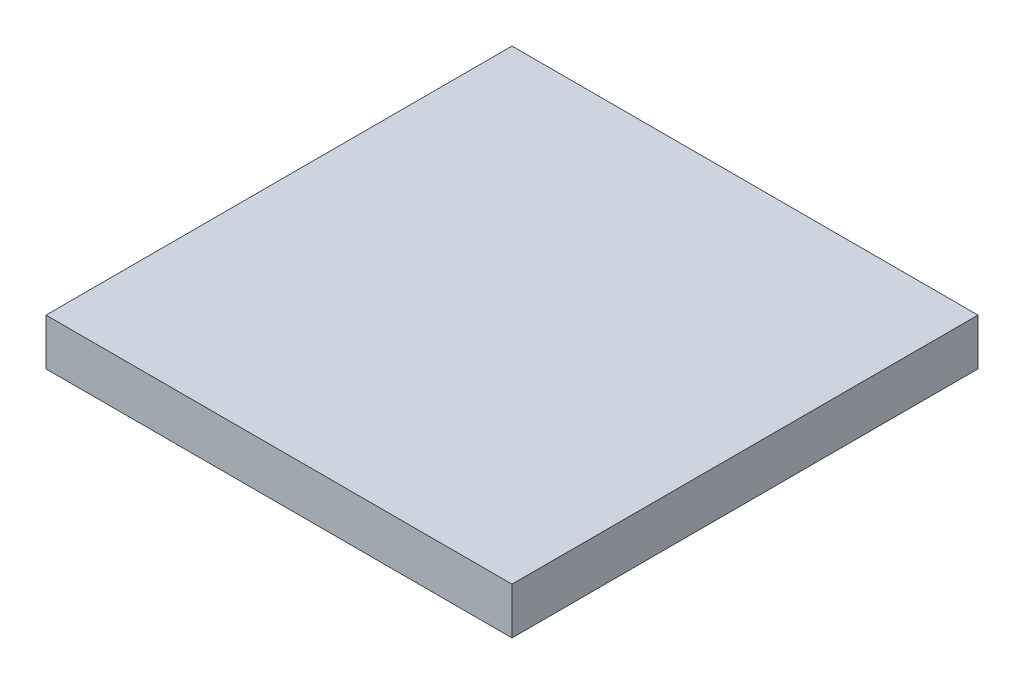
ISO-10303-21;
HEADER;
FILE_DESCRIPTION(('STEP AP214'),'2;1');
FILE_NAME('part.step','',(''),(''),'','','');
FILE_SCHEMA(('AUTOMOTIVE_DESIGN { 1 0 10303 214 1 1 1 1 }'));
ENDSEC;
DATA;
#1=APPLICATION_CONTEXT('core data for automotive mechanical design processes');
#2=APPLICATION_PROTOCOL_DEFINITION('international standard','automotive_design',2000,#1);
#3=PRODUCT_CONTEXT('',#1,'mechanical');
#4=PRODUCT('Part','Part','',(#3));
#5=PRODUCT_RELATED_PRODUCT_CATEGORY('part','',(#4));
#6=PRODUCT_DEFINITION_FORMATION('','',#4);
#7=PRODUCT_DEFINITION_CONTEXT('part definition',#1,'design');
#8=PRODUCT_DEFINITION('design','',#6,#7);
#9=PRODUCT_DEFINITION_SHAPE('','',#8);
#10=(LENGTH_UNIT() NAMED_UNIT(*) SI_UNIT(.MILLI.,.METRE.));
#11=(NAMED_UNIT(*) PLANE_ANGLE_UNIT() SI_UNIT($,.RADIAN.));
#12=(NAMED_UNIT(*) SI_UNIT($,.STERADIAN.) SOLID_ANGLE_UNIT());
#13=UNCERTAINTY_MEASURE_WITH_UNIT(LENGTH_MEASURE(1.E-05),#10,'distance_accuracy_value','');
#14=(GEOMETRIC_REPRESENTATION_CONTEXT(3) GLOBAL_UNCERTAINTY_ASSIGNED_CONTEXT((#13)) GLOBAL_UNIT_ASSIGNED_CONTEXT((#10,
#11,#12)) REPRESENTATION_CONTEXT('',''));
#15=CARTESIAN_POINT('',(0.,0.,0.));
#16=DIRECTION('',(0.,0.,1.));
#17=DIRECTION('',(1.,0.,0.));
#18=AXIS2_PLACEMENT_3D('',#15,#16,#17);
#19=CARTESIAN_POINT('',(50.,10.,50.));
#20=DIRECTION('',(-1.,0.,0.));
#21=DIRECTION('',(0.,0.,1.));
#22=AXIS2_PLACEMENT_3D('',#19,#20,#21);
#23=PLANE('',#22);
#24=DIRECTION('',(0.,0.,-1.));
#25=VECTOR('',#24,1.);
#26=CARTESIAN_POINT('',(50.,0.,50.));
#27=LINE('',#26,#25);
#28=CARTESIAN_POINT('',(50.,0.,50.));
#29=VERTEX_POINT('',#28);
#30=CARTESIAN_POINT('',(50.,0.,-50.));
#31=VERTEX_POINT('',#30);
#32=EDGE_CURVE('E98',#29,#31,#27,.T.);
#33=ORIENTED_EDGE('',*,*,#32,.T.);
#34=DIRECTION('',(0.,-1.,0.));
#35=VECTOR('',#34,1.);
#36=CARTESIAN_POINT('',(50.,10.,-50.));
#37=LINE('',#36,#35);
#38=CARTESIAN_POINT('',(50.,10.,-50.));
#39=VERTEX_POINT('',#38);
#40=EDGE_CURVE('E11',#39,#31,#37,.T.);
#41=ORIENTED_EDGE('',*,*,#40,.F.);
#42=DIRECTION('',(0.,0.,-1.));
#43=VECTOR('',#42,1.);
#44=CARTESIAN_POINT('',(50.,10.,50.));
#45=LINE('',#44,#43);
#46=CARTESIAN_POINT('',(50.,10.,50.));
#47=VERTEX_POINT('',#46);
#48=EDGE_CURVE('E86',#47,#39,#45,.T.);
#49=ORIENTED_EDGE('',*,*,#48,.F.);
#50=DIRECTION('',(0.,-1.,0.));
#51=VECTOR('',#50,1.);
#52=CARTESIAN_POINT('',(50.,10.,50.));
#53=LINE('',#52,#51);
#54=EDGE_CURVE('E94',#47,#29,#53,.T.);
#55=ORIENTED_EDGE('',*,*,#54,.T.);
#56=EDGE_LOOP('',(#33,#41,#49,#55));
#57=FACE_BOUND('',#56,.T.);
#58=ADVANCED_FACE('F35',(#57),#23,.F.);
#59=CARTESIAN_POINT('',(-50.,10.,-50.));
#60=DIRECTION('',(0.,0.,1.));
#61=DIRECTION('',(1.,0.,0.));
#62=AXIS2_PLACEMENT_3D('',#59,#60,#61);
#63=PLANE('',#62);
#64=DIRECTION('',(-1.,0.,0.));
#65=VECTOR('',#64,1.);
#66=CARTESIAN_POINT('',(-50.,0.,-50.));
#67=LINE('',#66,#65);
#68=CARTESIAN_POINT('',(-50.,0.,-50.));
#69=VERTEX_POINT('',#68);
#70=EDGE_CURVE('E90',#31,#69,#67,.T.);
#71=ORIENTED_EDGE('',*,*,#70,.T.);
#72=DIRECTION('',(0.,-1.,0.));
#73=VECTOR('',#72,1.);
#74=CARTESIAN_POINT('',(-50.,10.,-50.));
#75=LINE('',#74,#73);
#76=CARTESIAN_POINT('',(-50.,10.,-50.));
#77=VERTEX_POINT('',#76);
#78=EDGE_CURVE('E43',#77,#69,#75,.T.);
#79=ORIENTED_EDGE('',*,*,#78,.F.);
#80=DIRECTION('',(-1.,0.,0.));
#81=VECTOR('',#80,1.);
#82=CARTESIAN_POINT('',(-50.,10.,-50.));
#83=LINE('',#82,#81);
#84=EDGE_CURVE('E81',#39,#77,#83,.T.);
#85=ORIENTED_EDGE('',*,*,#84,.F.);
#86=ORIENTED_EDGE('',*,*,#40,.T.);
#87=EDGE_LOOP('',(#71,#79,#85,#86));
#88=FACE_BOUND('',#87,.T.);
#89=ADVANCED_FACE('F89',(#88),#63,.F.);
#90=CARTESIAN_POINT('',(-50.,10.,50.));
#91=DIRECTION('',(1.,0.,0.));
#92=DIRECTION('',(0.,0.,-1.));
#93=AXIS2_PLACEMENT_3D('',#90,#91,#92);
#94=PLANE('',#93);
#95=DIRECTION('',(0.,0.,1.));
#96=VECTOR('',#95,1.);
#97=CARTESIAN_POINT('',(-50.,0.,50.));
#98=LINE('',#97,#96);
#99=CARTESIAN_POINT('',(-50.,0.,50.));
#100=VERTEX_POINT('',#99);
#101=EDGE_CURVE('E68',#69,#100,#98,.T.);
#102=ORIENTED_EDGE('',*,*,#101,.T.);
#103=DIRECTION('',(0.,-1.,0.));
#104=VECTOR('',#103,1.);
#105=CARTESIAN_POINT('',(-50.,10.,50.));
#106=LINE('',#105,#104);
#107=CARTESIAN_POINT('',(-50.,10.,50.));
#108=VERTEX_POINT('',#107);
#109=EDGE_CURVE('E91',#108,#100,#106,.T.);
#110=ORIENTED_EDGE('',*,*,#109,.F.);
#111=DIRECTION('',(0.,0.,1.));
#112=VECTOR('',#111,1.);
#113=CARTESIAN_POINT('',(-50.,10.,50.));
#114=LINE('',#113,#112);
#115=EDGE_CURVE('E84',#77,#108,#114,.T.);
#116=ORIENTED_EDGE('',*,*,#115,.F.);
#117=ORIENTED_EDGE('',*,*,#78,.T.);
#118=EDGE_LOOP('',(#102,#110,#116,#117));
#119=FACE_BOUND('',#118,.T.);
#120=ADVANCED_FACE('F92',(#119),#94,.F.);
#121=CARTESIAN_POINT('',(-50.,10.,50.));
#122=DIRECTION('',(0.,0.,-1.));
#123=DIRECTION('',(-1.,0.,0.));
#124=AXIS2_PLACEMENT_3D('',#121,#122,#123);
#125=PLANE('',#124);
#126=DIRECTION('',(1.,0.,0.));
#127=VECTOR('',#126,1.);
#128=CARTESIAN_POINT('',(-50.,0.,50.));
#129=LINE('',#128,#127);
#130=EDGE_CURVE('E74',#100,#29,#129,.T.);
#131=ORIENTED_EDGE('',*,*,#130,.T.);
#132=ORIENTED_EDGE('',*,*,#54,.F.);
#133=DIRECTION('',(1.,0.,0.));
#134=VECTOR('',#133,1.);
#135=CARTESIAN_POINT('',(-50.,10.,50.));
#136=LINE('',#135,#134);
#137=EDGE_CURVE('E51',#108,#47,#136,.T.);
#138=ORIENTED_EDGE('',*,*,#137,.F.);
#139=ORIENTED_EDGE('',*,*,#109,.T.);
#140=EDGE_LOOP('',(#131,#132,#138,#139));
#141=FACE_BOUND('',#140,.T.);
#142=ADVANCED_FACE('F105',(#141),#125,.F.);
#143=CARTESIAN_POINT('',(0.,10.,0.));
#144=DIRECTION('',(0.,-1.,0.));
#145=DIRECTION('',(0.,0.,-1.));
#146=AXIS2_PLACEMENT_3D('',#143,#144,#145);
#147=PLANE('',#146);
#148=ORIENTED_EDGE('',*,*,#48,.T.);
#149=ORIENTED_EDGE('',*,*,#84,.T.);
#150=ORIENTED_EDGE('',*,*,#115,.T.);
#151=ORIENTED_EDGE('',*,*,#137,.T.);
#152=EDGE_LOOP('',(#148,#149,#150,#151));
#153=FACE_BOUND('',#152,.T.);
#154=ADVANCED_FACE('F82',(#153),#147,.F.);
#155=CARTESIAN_POINT('',(0.,0.,0.));
#156=DIRECTION('',(0.,-1.,0.));
#157=DIRECTION('',(0.,0.,-1.));
#158=AXIS2_PLACEMENT_3D('',#155,#156,#157);
#159=PLANE('',#158);
#160=ORIENTED_EDGE('',*,*,#32,.F.);
#161=ORIENTED_EDGE('',*,*,#130,.F.);
#162=ORIENTED_EDGE('',*,*,#101,.F.);
#163=ORIENTED_EDGE('',*,*,#70,.F.);
#164=EDGE_LOOP('',(#160,#161,#162,#163));
#165=FACE_BOUND('',#164,.T.);
#166=ADVANCED_FACE('F108',(#165),#159,.T.);
#167=CLOSED_SHELL('',(#58,#89,#120,#142,#154,#166));
#168=MANIFOLD_SOLID_BREP('B2',#167);
#169=ADVANCED_BREP_SHAPE_REPRESENTATION('',(#18,#168),#14);
#170=SHAPE_DEFINITION_REPRESENTATION(#9,#169);
ENDSEC;
END-ISO-10303-21;
